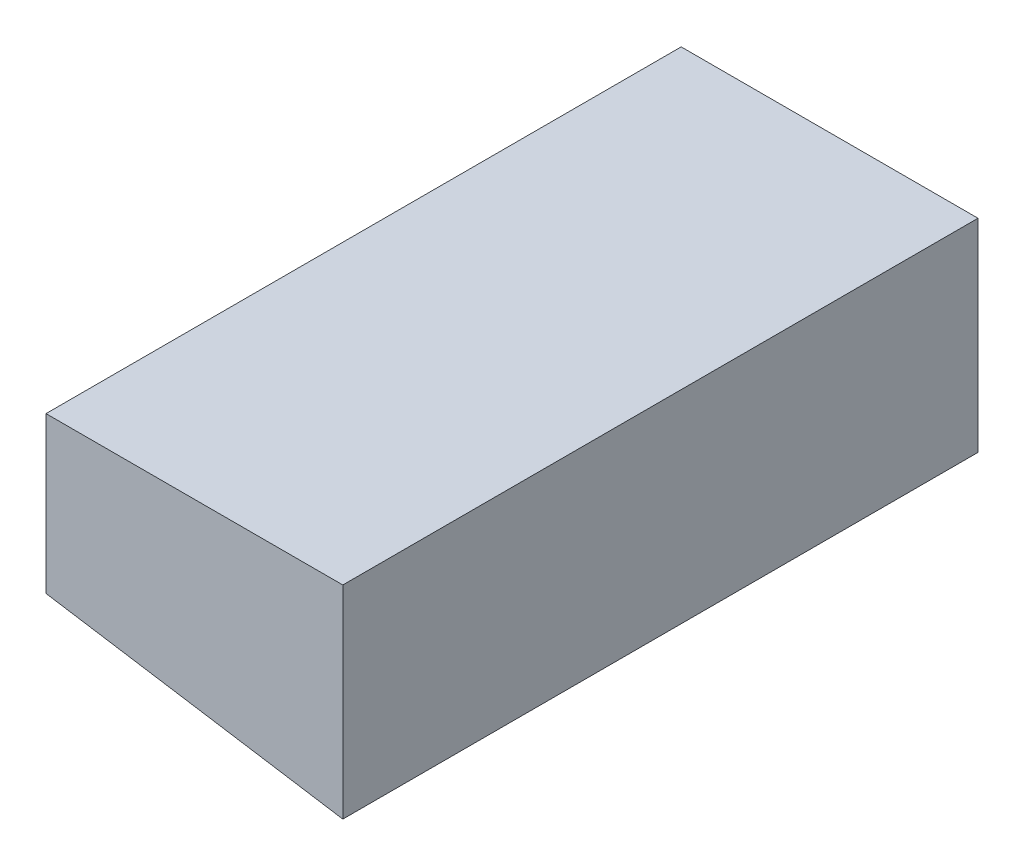
ISO-10303-21;
HEADER;
FILE_DESCRIPTION(('STEP AP214'),'2;1');
FILE_NAME('part.step','',(''),(''),'','','');
FILE_SCHEMA(('AUTOMOTIVE_DESIGN { 1 0 10303 214 1 1 1 1 }'));
ENDSEC;
DATA;
#1=APPLICATION_CONTEXT('core data for automotive mechanical design processes');
#2=APPLICATION_PROTOCOL_DEFINITION('international standard','automotive_design',2000,#1);
#3=PRODUCT_CONTEXT('',#1,'mechanical');
#4=PRODUCT('Part','Part','',(#3));
#5=PRODUCT_RELATED_PRODUCT_CATEGORY('part','',(#4));
#6=PRODUCT_DEFINITION_FORMATION('','',#4);
#7=PRODUCT_DEFINITION_CONTEXT('part definition',#1,'design');
#8=PRODUCT_DEFINITION('design','',#6,#7);
#9=PRODUCT_DEFINITION_SHAPE('','',#8);
#10=(LENGTH_UNIT() NAMED_UNIT(*) SI_UNIT(.MILLI.,.METRE.));
#11=(NAMED_UNIT(*) PLANE_ANGLE_UNIT() SI_UNIT($,.RADIAN.));
#12=(NAMED_UNIT(*) SI_UNIT($,.STERADIAN.) SOLID_ANGLE_UNIT());
#13=UNCERTAINTY_MEASURE_WITH_UNIT(LENGTH_MEASURE(1.E-05),#10,'distance_accuracy_value','');
#14=(GEOMETRIC_REPRESENTATION_CONTEXT(3) GLOBAL_UNCERTAINTY_ASSIGNED_CONTEXT((#13)) GLOBAL_UNIT_ASSIGNED_CONTEXT((#10,
#11,#12)) REPRESENTATION_CONTEXT('',''));
#15=CARTESIAN_POINT('',(0.,0.,0.));
#16=DIRECTION('',(0.,0.,1.));
#17=DIRECTION('',(1.,0.,0.));
#18=AXIS2_PLACEMENT_3D('',#15,#16,#17);
#19=CARTESIAN_POINT('',(-46.5351446598079,50.,-23.1059919665018));
#20=DIRECTION('',(1.,0.,0.));
#21=DIRECTION('',(0.,0.,-1.));
#22=AXIS2_PLACEMENT_3D('',#19,#20,#21);
#23=PLANE('',#22);
#24=DIRECTION('',(0.,-1.,0.));
#25=VECTOR('',#24,1.);
#26=CARTESIAN_POINT('',(-46.5351446598079,50.,-23.1059919665018));
#27=LINE('',#26,#25);
#28=CARTESIAN_POINT('',(-46.5351446598079,50.,-23.1059919665018));
#29=VERTEX_POINT('',#28);
#30=CARTESIAN_POINT('',(-46.5351446598079,23.7576660486816,-23.1059919665018));
#31=VERTEX_POINT('',#30);
#32=EDGE_CURVE('E102',#29,#31,#27,.T.);
#33=ORIENTED_EDGE('',*,*,#32,.T.);
#34=DIRECTION('',(0.,0.,1.));
#35=VECTOR('',#34,1.);
#36=CARTESIAN_POINT('',(-46.5351446598079,23.7576660486816,-23.1059919665018));
#37=LINE('',#36,#35);
#38=CARTESIAN_POINT('',(-46.5351446598079,23.7576660486816,83.8940080334982));
#39=VERTEX_POINT('',#38);
#40=EDGE_CURVE('E94',#31,#39,#37,.T.);
#41=ORIENTED_EDGE('',*,*,#40,.T.);
#42=DIRECTION('',(0.,-1.,0.));
#43=VECTOR('',#42,1.);
#44=CARTESIAN_POINT('',(-46.5351446598079,50.,83.8940080334982));
#45=LINE('',#44,#43);
#46=CARTESIAN_POINT('',(-46.5351446598079,50.,83.8940080334982));
#47=VERTEX_POINT('',#46);
#48=EDGE_CURVE('E77',#47,#39,#45,.T.);
#49=ORIENTED_EDGE('',*,*,#48,.F.);
#50=DIRECTION('',(0.,0.,1.));
#51=VECTOR('',#50,1.);
#52=CARTESIAN_POINT('',(-46.5351446598079,50.,-23.1059919665018));
#53=LINE('',#52,#51);
#54=EDGE_CURVE('E82',#29,#47,#53,.T.);
#55=ORIENTED_EDGE('',*,*,#54,.F.);
#56=EDGE_LOOP('',(#33,#41,#49,#55));
#57=FACE_BOUND('',#56,.T.);
#58=ADVANCED_FACE('F35',(#57),#23,.F.);
#59=CARTESIAN_POINT('',(-46.5351446598079,50.,83.8940080334982));
#60=DIRECTION('',(0.,0.,-1.));
#61=DIRECTION('',(-1.,0.,0.));
#62=AXIS2_PLACEMENT_3D('',#59,#60,#61);
#63=PLANE('',#62);
#64=ORIENTED_EDGE('',*,*,#48,.T.);
#65=DIRECTION('',(-0.987688340595137,0.156434465040238,0.));
#66=VECTOR('',#65,1.);
#67=CARTESIAN_POINT('',(-46.5351446598079,23.7576660486816,83.8940080334982));
#68=LINE('',#67,#66);
#69=CARTESIAN_POINT('',(3.46485534019214,15.8384440324544,83.8940080334982));
#70=VERTEX_POINT('',#69);
#71=EDGE_CURVE('E57',#39,#70,#68,.F.);
#72=ORIENTED_EDGE('',*,*,#71,.T.);
#73=DIRECTION('',(0.,-1.,0.));
#74=VECTOR('',#73,1.);
#75=CARTESIAN_POINT('',(3.46485534019214,50.,83.8940080334982));
#76=LINE('',#75,#74);
#77=CARTESIAN_POINT('',(3.46485534019214,50.,83.8940080334982));
#78=VERTEX_POINT('',#77);
#79=EDGE_CURVE('E78',#78,#70,#76,.T.);
#80=ORIENTED_EDGE('',*,*,#79,.F.);
#81=DIRECTION('',(1.,0.,0.));
#82=VECTOR('',#81,1.);
#83=CARTESIAN_POINT('',(-46.5351446598079,50.,83.8940080334982));
#84=LINE('',#83,#82);
#85=EDGE_CURVE('E73',#47,#78,#84,.T.);
#86=ORIENTED_EDGE('',*,*,#85,.F.);
#87=EDGE_LOOP('',(#64,#72,#80,#86));
#88=FACE_BOUND('',#87,.T.);
#89=ADVANCED_FACE('F75',(#88),#63,.F.);
#90=CARTESIAN_POINT('',(3.46485534019213,50.,-23.1059919665018));
#91=DIRECTION('',(-1.,0.,0.));
#92=DIRECTION('',(0.,0.,1.));
#93=AXIS2_PLACEMENT_3D('',#90,#91,#92);
#94=PLANE('',#93);
#95=ORIENTED_EDGE('',*,*,#79,.T.);
#96=DIRECTION('',(0.,0.,1.));
#97=VECTOR('',#96,1.);
#98=CARTESIAN_POINT('',(3.46485534019213,15.8384440324544,-23.1059919665018));
#99=LINE('',#98,#97);
#100=CARTESIAN_POINT('',(3.46485534019212,15.8384440324544,-23.1059919665018));
#101=VERTEX_POINT('',#100);
#102=EDGE_CURVE('E43',#70,#101,#99,.F.);
#103=ORIENTED_EDGE('',*,*,#102,.T.);
#104=DIRECTION('',(0.,-1.,0.));
#105=VECTOR('',#104,1.);
#106=CARTESIAN_POINT('',(3.46485534019213,50.,-23.1059919665018));
#107=LINE('',#106,#105);
#108=CARTESIAN_POINT('',(3.46485534019213,50.,-23.1059919665018));
#109=VERTEX_POINT('',#108);
#110=EDGE_CURVE('E97',#109,#101,#107,.T.);
#111=ORIENTED_EDGE('',*,*,#110,.F.);
#112=DIRECTION('',(0.,0.,-1.));
#113=VECTOR('',#112,1.);
#114=CARTESIAN_POINT('',(3.46485534019213,50.,-23.1059919665018));
#115=LINE('',#114,#113);
#116=EDGE_CURVE('E81',#78,#109,#115,.T.);
#117=ORIENTED_EDGE('',*,*,#116,.F.);
#118=EDGE_LOOP('',(#95,#103,#111,#117));
#119=FACE_BOUND('',#118,.T.);
#120=ADVANCED_FACE('F105',(#119),#94,.F.);
#121=CARTESIAN_POINT('',(-46.5351446598079,50.,-23.1059919665018));
#122=DIRECTION('',(0.,0.,1.));
#123=DIRECTION('',(1.,0.,0.));
#124=AXIS2_PLACEMENT_3D('',#121,#122,#123);
#125=PLANE('',#124);
#126=ORIENTED_EDGE('',*,*,#110,.T.);
#127=DIRECTION('',(0.987688340595137,-0.156434465040238,0.));
#128=VECTOR('',#127,1.);
#129=CARTESIAN_POINT('',(-46.5351446598079,23.7576660486816,-23.1059919665018));
#130=LINE('',#129,#128);
#131=EDGE_CURVE('E11',#101,#31,#130,.F.);
#132=ORIENTED_EDGE('',*,*,#131,.T.);
#133=ORIENTED_EDGE('',*,*,#32,.F.);
#134=DIRECTION('',(-1.,0.,0.));
#135=VECTOR('',#134,1.);
#136=CARTESIAN_POINT('',(-46.5351446598079,50.,-23.1059919665018));
#137=LINE('',#136,#135);
#138=EDGE_CURVE('E87',#109,#29,#137,.T.);
#139=ORIENTED_EDGE('',*,*,#138,.F.);
#140=EDGE_LOOP('',(#126,#132,#133,#139));
#141=FACE_BOUND('',#140,.T.);
#142=ADVANCED_FACE('F108',(#141),#125,.F.);
#143=CARTESIAN_POINT('',(0.,50.,0.));
#144=DIRECTION('',(0.,1.,0.));
#145=DIRECTION('',(0.,0.,1.));
#146=AXIS2_PLACEMENT_3D('',#143,#144,#145);
#147=PLANE('',#146);
#148=ORIENTED_EDGE('',*,*,#54,.T.);
#149=ORIENTED_EDGE('',*,*,#85,.T.);
#150=ORIENTED_EDGE('',*,*,#116,.T.);
#151=ORIENTED_EDGE('',*,*,#138,.T.);
#152=EDGE_LOOP('',(#148,#149,#150,#151));
#153=FACE_BOUND('',#152,.T.);
#154=ADVANCED_FACE('F85',(#153),#147,.T.);
#155=CARTESIAN_POINT('',(-46.5351446598079,23.7576660486816,-23.1059919665018));
#156=DIRECTION('',(0.156434465040238,0.987688340595137,0.));
#157=DIRECTION('',(0.,0.,1.));
#158=AXIS2_PLACEMENT_3D('',#155,#156,#157);
#159=PLANE('',#158);
#160=ORIENTED_EDGE('',*,*,#131,.F.);
#161=ORIENTED_EDGE('',*,*,#102,.F.);
#162=ORIENTED_EDGE('',*,*,#71,.F.);
#163=ORIENTED_EDGE('',*,*,#40,.F.);
#164=EDGE_LOOP('',(#160,#161,#162,#163));
#165=FACE_BOUND('',#164,.T.);
#166=ADVANCED_FACE('F37',(#165),#159,.F.);
#167=CLOSED_SHELL('',(#58,#89,#120,#142,#154,#166));
#168=MANIFOLD_SOLID_BREP('B2',#167);
#169=ADVANCED_BREP_SHAPE_REPRESENTATION('',(#18,#168),#14);
#170=SHAPE_DEFINITION_REPRESENTATION(#9,#169);
ENDSEC;
END-ISO-10303-21;
